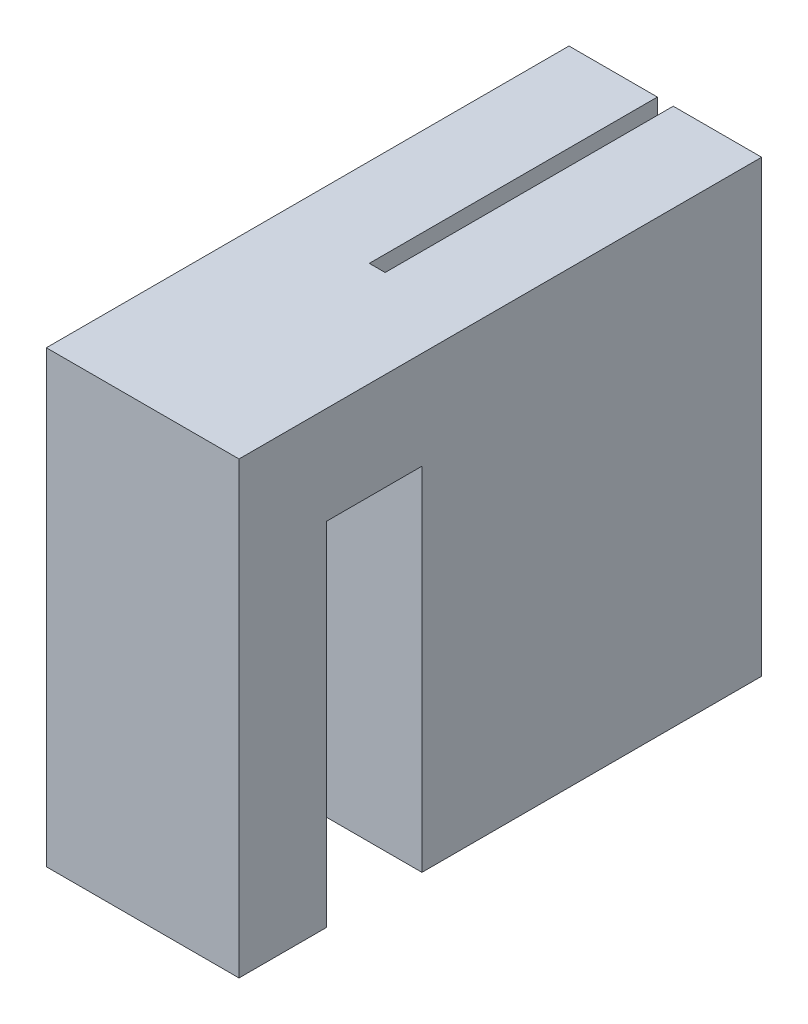
ISO-10303-21;
HEADER;
FILE_DESCRIPTION(('STEP AP214'),'2;1');
FILE_NAME('part.step','',(''),(''),'','','');
FILE_SCHEMA(('AUTOMOTIVE_DESIGN { 1 0 10303 214 1 1 1 1 }'));
ENDSEC;
DATA;
#1=APPLICATION_CONTEXT('core data for automotive mechanical design processes');
#2=APPLICATION_PROTOCOL_DEFINITION('international standard','automotive_design',2000,#1);
#3=PRODUCT_CONTEXT('',#1,'mechanical');
#4=PRODUCT('Part','Part','',(#3));
#5=PRODUCT_RELATED_PRODUCT_CATEGORY('part','',(#4));
#6=PRODUCT_DEFINITION_FORMATION('','',#4);
#7=PRODUCT_DEFINITION_CONTEXT('part definition',#1,'design');
#8=PRODUCT_DEFINITION('design','',#6,#7);
#9=PRODUCT_DEFINITION_SHAPE('','',#8);
#10=(LENGTH_UNIT() NAMED_UNIT(*) SI_UNIT(.MILLI.,.METRE.));
#11=(NAMED_UNIT(*) PLANE_ANGLE_UNIT() SI_UNIT($,.RADIAN.));
#12=(NAMED_UNIT(*) SI_UNIT($,.STERADIAN.) SOLID_ANGLE_UNIT());
#13=UNCERTAINTY_MEASURE_WITH_UNIT(LENGTH_MEASURE(1.E-05),#10,'distance_accuracy_value','');
#14=(GEOMETRIC_REPRESENTATION_CONTEXT(3) GLOBAL_UNCERTAINTY_ASSIGNED_CONTEXT((#13)) GLOBAL_UNIT_ASSIGNED_CONTEXT((#10,
#11,#12)) REPRESENTATION_CONTEXT('',''));
#15=CARTESIAN_POINT('',(0.,0.,0.));
#16=DIRECTION('',(0.,0.,1.));
#17=DIRECTION('',(1.,0.,0.));
#18=AXIS2_PLACEMENT_3D('',#15,#16,#17);
#19=CARTESIAN_POINT('',(-0.912,9.93366486269097,0.));
#20=DIRECTION('',(0.,-1.,0.));
#21=DIRECTION('',(0.,0.,-1.));
#22=AXIS2_PLACEMENT_3D('',#19,#20,#21);
#23=PLANE('',#22);
#24=DIRECTION('',(0.,0.,-1.));
#25=VECTOR('',#24,1.);
#26=CARTESIAN_POINT('',(0.,9.93366486269097,0.));
#27=LINE('',#26,#25);
#28=CARTESIAN_POINT('',(0.,9.93366486269097,-13.4799668601003));
#29=VERTEX_POINT('',#28);
#30=CARTESIAN_POINT('',(0.,9.93366486269097,-30.0377124002651));
#31=VERTEX_POINT('',#30);
#32=EDGE_CURVE('E207',#29,#31,#27,.T.);
#33=ORIENTED_EDGE('',*,*,#32,.T.);
#34=DIRECTION('',(1.,0.,0.));
#35=VECTOR('',#34,1.);
#36=CARTESIAN_POINT('',(-0.912,9.93366486269097,-30.0377124002651));
#37=LINE('',#36,#35);
#38=CARTESIAN_POINT('',(-0.912,9.93366486269097,-30.0377124002651));
#39=VERTEX_POINT('',#38);
#40=EDGE_CURVE('E11',#39,#31,#37,.T.);
#41=ORIENTED_EDGE('',*,*,#40,.F.);
#42=DIRECTION('',(0.,0.,-1.));
#43=VECTOR('',#42,1.);
#44=CARTESIAN_POINT('',(-0.912,9.93366486269097,0.));
#45=LINE('',#44,#43);
#46=CARTESIAN_POINT('',(-0.912,9.93366486269097,-13.4799668601003));
#47=VERTEX_POINT('',#46);
#48=EDGE_CURVE('E38',#47,#39,#45,.T.);
#49=ORIENTED_EDGE('',*,*,#48,.F.);
#50=DIRECTION('',(1.,0.,0.));
#51=VECTOR('',#50,1.);
#52=CARTESIAN_POINT('',(-0.912,9.93366486269097,-13.4799668601003));
#53=LINE('',#52,#51);
#54=EDGE_CURVE('E214',#47,#29,#53,.T.);
#55=ORIENTED_EDGE('',*,*,#54,.T.);
#56=EDGE_LOOP('',(#33,#41,#49,#55));
#57=FACE_BOUND('',#56,.T.);
#58=ADVANCED_FACE('F35',(#57),#23,.F.);
#59=CARTESIAN_POINT('',(-0.912,0.,-30.0377124002651));
#60=DIRECTION('',(0.,0.,1.));
#61=DIRECTION('',(0.,-1.,0.));
#62=AXIS2_PLACEMENT_3D('',#59,#60,#61);
#63=PLANE('',#62);
#64=ORIENTED_EDGE('',*,*,#40,.T.);
#65=DIRECTION('',(0.,-1.,0.));
#66=VECTOR('',#65,1.);
#67=CARTESIAN_POINT('',(0.,0.,-30.0377124002651));
#68=LINE('',#67,#66);
#69=CARTESIAN_POINT('',(0.,25.8349359100739,-30.0377124002651));
#70=VERTEX_POINT('',#69);
#71=EDGE_CURVE('E175',#70,#31,#68,.T.);
#72=ORIENTED_EDGE('',*,*,#71,.F.);
#73=DIRECTION('',(-1.,0.,0.));
#74=VECTOR('',#73,1.);
#75=CARTESIAN_POINT('',(5.08,25.8349359100739,-30.0377124002651));
#76=LINE('',#75,#74);
#77=CARTESIAN_POINT('',(5.08,25.8349359100739,-30.0377124002651));
#78=VERTEX_POINT('',#77);
#79=EDGE_CURVE('E193',#78,#70,#76,.T.);
#80=ORIENTED_EDGE('',*,*,#79,.F.);
#81=DIRECTION('',(0.,-1.,0.));
#82=VECTOR('',#81,1.);
#83=CARTESIAN_POINT('',(5.08,0.,-30.0377124002651));
#84=LINE('',#83,#82);
#85=CARTESIAN_POINT('',(5.08,0.,-30.0377124002651));
#86=VERTEX_POINT('',#85);
#87=EDGE_CURVE('E190',#78,#86,#84,.T.);
#88=ORIENTED_EDGE('',*,*,#87,.T.);
#89=DIRECTION('',(1.,0.,0.));
#90=VECTOR('',#89,1.);
#91=CARTESIAN_POINT('',(-0.912,0.,-30.0377124002651));
#92=LINE('',#91,#90);
#93=CARTESIAN_POINT('',(-5.992,0.,-30.0377124002651));
#94=VERTEX_POINT('',#93);
#95=EDGE_CURVE('E45',#94,#86,#92,.T.);
#96=ORIENTED_EDGE('',*,*,#95,.F.);
#97=DIRECTION('',(0.,-1.,0.));
#98=VECTOR('',#97,1.);
#99=CARTESIAN_POINT('',(-5.992,0.,-30.0377124002651));
#100=LINE('',#99,#98);
#101=CARTESIAN_POINT('',(-5.992,25.8349359100739,-30.0377124002651));
#102=VERTEX_POINT('',#101);
#103=EDGE_CURVE('E141',#102,#94,#100,.T.);
#104=ORIENTED_EDGE('',*,*,#103,.F.);
#105=DIRECTION('',(1.,0.,0.));
#106=VECTOR('',#105,1.);
#107=CARTESIAN_POINT('',(-5.992,25.8349359100739,-30.0377124002651));
#108=LINE('',#107,#106);
#109=CARTESIAN_POINT('',(-0.912,25.8349359100739,-30.0377124002651));
#110=VERTEX_POINT('',#109);
#111=EDGE_CURVE('E137',#102,#110,#108,.T.);
#112=ORIENTED_EDGE('',*,*,#111,.T.);
#113=DIRECTION('',(0.,-1.,0.));
#114=VECTOR('',#113,1.);
#115=CARTESIAN_POINT('',(-0.912,0.,-30.0377124002651));
#116=LINE('',#115,#114);
#117=EDGE_CURVE('E148',#110,#39,#116,.T.);
#118=ORIENTED_EDGE('',*,*,#117,.T.);
#119=EDGE_LOOP('',(#64,#72,#80,#88,#96,#104,#112,#118));
#120=FACE_BOUND('',#119,.T.);
#121=ADVANCED_FACE('F240',(#120),#63,.F.);
#122=CARTESIAN_POINT('',(-0.912,0.,0.));
#123=DIRECTION('',(0.,-1.,0.));
#124=DIRECTION('',(0.,0.,-1.));
#125=AXIS2_PLACEMENT_3D('',#122,#123,#124);
#126=PLANE('',#125);
#127=ORIENTED_EDGE('',*,*,#95,.T.);
#128=DIRECTION('',(0.,0.,-1.));
#129=VECTOR('',#128,1.);
#130=CARTESIAN_POINT('',(5.08,0.,0.));
#131=LINE('',#130,#129);
#132=CARTESIAN_POINT('',(5.08,0.,-10.5149830621972));
#133=VERTEX_POINT('',#132);
#134=EDGE_CURVE('E181',#133,#86,#131,.T.);
#135=ORIENTED_EDGE('',*,*,#134,.F.);
#136=DIRECTION('',(1.,0.,0.));
#137=VECTOR('',#136,1.);
#138=CARTESIAN_POINT('',(-0.912,0.,-10.5149830621972));
#139=LINE('',#138,#137);
#140=CARTESIAN_POINT('',(-5.992,0.,-10.5149830621972));
#141=VERTEX_POINT('',#140);
#142=EDGE_CURVE('E427',#141,#133,#139,.T.);
#143=ORIENTED_EDGE('',*,*,#142,.F.);
#144=DIRECTION('',(0.,0.,1.));
#145=VECTOR('',#144,1.);
#146=CARTESIAN_POINT('',(-5.992,0.,-10.5149830621972));
#147=LINE('',#146,#145);
#148=EDGE_CURVE('E155',#94,#141,#147,.T.);
#149=ORIENTED_EDGE('',*,*,#148,.F.);
#150=EDGE_LOOP('',(#127,#135,#143,#149));
#151=FACE_BOUND('',#150,.T.);
#152=ADVANCED_FACE('F244',(#151),#126,.T.);
#153=CARTESIAN_POINT('',(-0.912,0.,-10.5149830621972));
#154=DIRECTION('',(0.,0.,1.));
#155=DIRECTION('',(1.,0.,0.));
#156=AXIS2_PLACEMENT_3D('',#153,#154,#155);
#157=PLANE('',#156);
#158=ORIENTED_EDGE('',*,*,#142,.T.);
#159=DIRECTION('',(0.,-1.,0.));
#160=VECTOR('',#159,1.);
#161=CARTESIAN_POINT('',(5.08,0.,-10.5149830621972));
#162=LINE('',#161,#160);
#163=CARTESIAN_POINT('',(5.08,20.2184319162735,-10.5149830621972));
#164=VERTEX_POINT('',#163);
#165=EDGE_CURVE('E187',#164,#133,#162,.T.);
#166=ORIENTED_EDGE('',*,*,#165,.F.);
#167=DIRECTION('',(1.,0.,0.));
#168=VECTOR('',#167,1.);
#169=CARTESIAN_POINT('',(-0.912,20.2184319162735,-10.5149830621972));
#170=LINE('',#169,#168);
#171=CARTESIAN_POINT('',(-5.992,20.2184319162735,-10.5149830621972));
#172=VERTEX_POINT('',#171);
#173=EDGE_CURVE('E425',#172,#164,#170,.T.);
#174=ORIENTED_EDGE('',*,*,#173,.F.);
#175=DIRECTION('',(0.,1.,0.));
#176=VECTOR('',#175,1.);
#177=CARTESIAN_POINT('',(-5.992,20.2184319162735,-10.5149830621972));
#178=LINE('',#177,#176);
#179=EDGE_CURVE('E158',#141,#172,#178,.T.);
#180=ORIENTED_EDGE('',*,*,#179,.F.);
#181=EDGE_LOOP('',(#158,#166,#174,#180));
#182=FACE_BOUND('',#181,.T.);
#183=ADVANCED_FACE('F250',(#182),#157,.T.);
#184=CARTESIAN_POINT('',(-0.912,20.2184319162735,0.));
#185=DIRECTION('',(0.,-1.,0.));
#186=DIRECTION('',(0.,0.,-1.));
#187=AXIS2_PLACEMENT_3D('',#184,#185,#186);
#188=PLANE('',#187);
#189=ORIENTED_EDGE('',*,*,#173,.T.);
#190=DIRECTION('',(0.,0.,-1.));
#191=VECTOR('',#190,1.);
#192=CARTESIAN_POINT('',(5.08,20.2184319162735,0.));
#193=LINE('',#192,#191);
#194=CARTESIAN_POINT('',(5.08,20.2184319162735,-5.01498306219718));
#195=VERTEX_POINT('',#194);
#196=EDGE_CURVE('E184',#195,#164,#193,.T.);
#197=ORIENTED_EDGE('',*,*,#196,.F.);
#198=DIRECTION('',(1.,0.,0.));
#199=VECTOR('',#198,1.);
#200=CARTESIAN_POINT('',(-0.912,20.2184319162735,-5.01498306219718));
#201=LINE('',#200,#199);
#202=CARTESIAN_POINT('',(-5.992,20.2184319162735,-5.01498306219718));
#203=VERTEX_POINT('',#202);
#204=EDGE_CURVE('E421',#203,#195,#201,.T.);
#205=ORIENTED_EDGE('',*,*,#204,.F.);
#206=DIRECTION('',(0.,0.,1.));
#207=VECTOR('',#206,1.);
#208=CARTESIAN_POINT('',(-5.992,20.2184319162735,-5.01498306219718));
#209=LINE('',#208,#207);
#210=EDGE_CURVE('E161',#172,#203,#209,.T.);
#211=ORIENTED_EDGE('',*,*,#210,.F.);
#212=EDGE_LOOP('',(#189,#197,#205,#211));
#213=FACE_BOUND('',#212,.T.);
#214=ADVANCED_FACE('F259',(#213),#188,.T.);
#215=CARTESIAN_POINT('',(-0.912,0.,-5.01498306219718));
#216=DIRECTION('',(0.,0.,-1.));
#217=DIRECTION('',(-1.,0.,0.));
#218=AXIS2_PLACEMENT_3D('',#215,#216,#217);
#219=PLANE('',#218);
#220=ORIENTED_EDGE('',*,*,#204,.T.);
#221=DIRECTION('',(0.,1.,0.));
#222=VECTOR('',#221,1.);
#223=CARTESIAN_POINT('',(5.08,0.,-5.01498306219718));
#224=LINE('',#223,#222);
#225=CARTESIAN_POINT('',(5.08,0.,-5.01498306219718));
#226=VERTEX_POINT('',#225);
#227=EDGE_CURVE('E180',#226,#195,#224,.T.);
#228=ORIENTED_EDGE('',*,*,#227,.F.);
#229=DIRECTION('',(1.,0.,0.));
#230=VECTOR('',#229,1.);
#231=CARTESIAN_POINT('',(-0.912,0.,-5.01498306219718));
#232=LINE('',#231,#230);
#233=CARTESIAN_POINT('',(-5.992,0.,-5.01498306219718));
#234=VERTEX_POINT('',#233);
#235=EDGE_CURVE('E418',#234,#226,#232,.T.);
#236=ORIENTED_EDGE('',*,*,#235,.F.);
#237=DIRECTION('',(0.,-1.,0.));
#238=VECTOR('',#237,1.);
#239=CARTESIAN_POINT('',(-5.992,0.,-5.01498306219718));
#240=LINE('',#239,#238);
#241=EDGE_CURVE('E164',#203,#234,#240,.T.);
#242=ORIENTED_EDGE('',*,*,#241,.F.);
#243=EDGE_LOOP('',(#220,#228,#236,#242));
#244=FACE_BOUND('',#243,.T.);
#245=ADVANCED_FACE('F263',(#244),#219,.T.);
#246=ORIENTED_EDGE('',*,*,#235,.T.);
#247=CARTESIAN_POINT('',(5.08,0.,0.));
#248=VERTEX_POINT('',#247);
#249=EDGE_CURVE('E177',#248,#226,#131,.T.);
#250=ORIENTED_EDGE('',*,*,#249,.F.);
#251=DIRECTION('',(1.,0.,0.));
#252=VECTOR('',#251,1.);
#253=CARTESIAN_POINT('',(-0.912,0.,0.));
#254=LINE('',#253,#252);
#255=CARTESIAN_POINT('',(-5.992,0.,0.));
#256=VERTEX_POINT('',#255);
#257=EDGE_CURVE('E130',#256,#248,#254,.T.);
#258=ORIENTED_EDGE('',*,*,#257,.F.);
#259=DIRECTION('',(0.,0.,1.));
#260=VECTOR('',#259,1.);
#261=CARTESIAN_POINT('',(-5.992,0.,0.));
#262=LINE('',#261,#260);
#263=EDGE_CURVE('E147',#234,#256,#262,.T.);
#264=ORIENTED_EDGE('',*,*,#263,.F.);
#265=EDGE_LOOP('',(#246,#250,#258,#264));
#266=FACE_BOUND('',#265,.T.);
#267=ADVANCED_FACE('F253',(#266),#126,.T.);
#268=CARTESIAN_POINT('',(-0.912,0.,0.));
#269=DIRECTION('',(0.,0.,1.));
#270=DIRECTION('',(0.,-1.,0.));
#271=AXIS2_PLACEMENT_3D('',#268,#269,#270);
#272=PLANE('',#271);
#273=ORIENTED_EDGE('',*,*,#257,.T.);
#274=DIRECTION('',(0.,-1.,0.));
#275=VECTOR('',#274,1.);
#276=CARTESIAN_POINT('',(5.08,0.,0.));
#277=LINE('',#276,#275);
#278=CARTESIAN_POINT('',(5.08,25.8349359100739,0.));
#279=VERTEX_POINT('',#278);
#280=EDGE_CURVE('E126',#279,#248,#277,.T.);
#281=ORIENTED_EDGE('',*,*,#280,.F.);
#282=DIRECTION('',(1.,0.,0.));
#283=VECTOR('',#282,1.);
#284=CARTESIAN_POINT('',(-0.912,25.8349359100739,0.));
#285=LINE('',#284,#283);
#286=CARTESIAN_POINT('',(-5.992,25.8349359100739,0.));
#287=VERTEX_POINT('',#286);
#288=EDGE_CURVE('E120',#287,#279,#285,.T.);
#289=ORIENTED_EDGE('',*,*,#288,.F.);
#290=DIRECTION('',(0.,1.,0.));
#291=VECTOR('',#290,1.);
#292=CARTESIAN_POINT('',(-5.992,25.8349359100739,0.));
#293=LINE('',#292,#291);
#294=EDGE_CURVE('E124',#256,#287,#293,.T.);
#295=ORIENTED_EDGE('',*,*,#294,.F.);
#296=EDGE_LOOP('',(#273,#281,#289,#295));
#297=FACE_BOUND('',#296,.T.);
#298=ADVANCED_FACE('F122',(#297),#272,.T.);
#299=CARTESIAN_POINT('',(-0.912,25.8349359100739,0.));
#300=DIRECTION('',(0.,-1.,0.));
#301=DIRECTION('',(0.,0.,-1.));
#302=AXIS2_PLACEMENT_3D('',#299,#300,#301);
#303=PLANE('',#302);
#304=ORIENTED_EDGE('',*,*,#288,.T.);
#305=DIRECTION('',(0.,0.,-1.));
#306=VECTOR('',#305,1.);
#307=CARTESIAN_POINT('',(5.08,25.8349359100739,0.));
#308=LINE('',#307,#306);
#309=EDGE_CURVE('E173',#279,#78,#308,.T.);
#310=ORIENTED_EDGE('',*,*,#309,.T.);
#311=ORIENTED_EDGE('',*,*,#79,.T.);
#312=DIRECTION('',(0.,0.,-1.));
#313=VECTOR('',#312,1.);
#314=CARTESIAN_POINT('',(0.,25.8349359100739,0.));
#315=LINE('',#314,#313);
#316=CARTESIAN_POINT('',(0.,25.8349359100739,-13.4799668601003));
#317=VERTEX_POINT('',#316);
#318=EDGE_CURVE('E199',#317,#70,#315,.T.);
#319=ORIENTED_EDGE('',*,*,#318,.F.);
#320=DIRECTION('',(1.,0.,0.));
#321=VECTOR('',#320,1.);
#322=CARTESIAN_POINT('',(-0.912,25.8349359100739,-13.4799668601003));
#323=LINE('',#322,#321);
#324=CARTESIAN_POINT('',(-0.912,25.8349359100739,-13.4799668601003));
#325=VERTEX_POINT('',#324);
#326=EDGE_CURVE('E131',#325,#317,#323,.T.);
#327=ORIENTED_EDGE('',*,*,#326,.F.);
#328=DIRECTION('',(0.,0.,-1.));
#329=VECTOR('',#328,1.);
#330=CARTESIAN_POINT('',(-0.912,25.8349359100739,-30.0377124002651));
#331=LINE('',#330,#329);
#332=EDGE_CURVE('E151',#325,#110,#331,.T.);
#333=ORIENTED_EDGE('',*,*,#332,.T.);
#334=ORIENTED_EDGE('',*,*,#111,.F.);
#335=DIRECTION('',(0.,0.,-1.));
#336=VECTOR('',#335,1.);
#337=CARTESIAN_POINT('',(-5.992,25.8349359100739,-30.0377124002651));
#338=LINE('',#337,#336);
#339=EDGE_CURVE('E134',#287,#102,#338,.T.);
#340=ORIENTED_EDGE('',*,*,#339,.F.);
#341=EDGE_LOOP('',(#304,#310,#311,#319,#327,#333,#334,#340));
#342=FACE_BOUND('',#341,.T.);
#343=ADVANCED_FACE('F135',(#342),#303,.F.);
#344=CARTESIAN_POINT('',(-0.912,0.,-13.4799668601003));
#345=DIRECTION('',(0.,0.,1.));
#346=DIRECTION('',(0.,-1.,0.));
#347=AXIS2_PLACEMENT_3D('',#344,#345,#346);
#348=PLANE('',#347);
#349=DIRECTION('',(0.,-1.,0.));
#350=VECTOR('',#349,1.);
#351=CARTESIAN_POINT('',(0.,0.,-13.4799668601003));
#352=LINE('',#351,#350);
#353=EDGE_CURVE('E210',#317,#29,#352,.T.);
#354=ORIENTED_EDGE('',*,*,#353,.T.);
#355=ORIENTED_EDGE('',*,*,#54,.F.);
#356=DIRECTION('',(0.,-1.,0.));
#357=VECTOR('',#356,1.);
#358=CARTESIAN_POINT('',(-0.912,0.,-13.4799668601003));
#359=LINE('',#358,#357);
#360=EDGE_CURVE('E212',#325,#47,#359,.T.);
#361=ORIENTED_EDGE('',*,*,#360,.F.);
#362=ORIENTED_EDGE('',*,*,#326,.T.);
#363=EDGE_LOOP('',(#354,#355,#361,#362));
#364=FACE_BOUND('',#363,.T.);
#365=ADVANCED_FACE('F232',(#364),#348,.F.);
#366=CARTESIAN_POINT('',(5.08,0.,0.));
#367=DIRECTION('',(1.,0.,0.));
#368=DIRECTION('',(0.,0.,-1.));
#369=AXIS2_PLACEMENT_3D('',#366,#367,#368);
#370=PLANE('',#369);
#371=ORIENTED_EDGE('',*,*,#309,.F.);
#372=ORIENTED_EDGE('',*,*,#280,.T.);
#373=ORIENTED_EDGE('',*,*,#249,.T.);
#374=ORIENTED_EDGE('',*,*,#227,.T.);
#375=ORIENTED_EDGE('',*,*,#196,.T.);
#376=ORIENTED_EDGE('',*,*,#165,.T.);
#377=ORIENTED_EDGE('',*,*,#134,.T.);
#378=ORIENTED_EDGE('',*,*,#87,.F.);
#379=EDGE_LOOP('',(#371,#372,#373,#374,#375,#376,#377,#378));
#380=FACE_BOUND('',#379,.T.);
#381=ADVANCED_FACE('F272',(#380),#370,.T.);
#382=CARTESIAN_POINT('',(0.,0.,0.));
#383=DIRECTION('',(1.,0.,0.));
#384=DIRECTION('',(0.,0.,-1.));
#385=AXIS2_PLACEMENT_3D('',#382,#383,#384);
#386=PLANE('',#385);
#387=ORIENTED_EDGE('',*,*,#32,.F.);
#388=ORIENTED_EDGE('',*,*,#353,.F.);
#389=ORIENTED_EDGE('',*,*,#318,.T.);
#390=ORIENTED_EDGE('',*,*,#71,.T.);
#391=EDGE_LOOP('',(#387,#388,#389,#390));
#392=FACE_BOUND('',#391,.T.);
#393=ADVANCED_FACE('F238',(#392),#386,.F.);
#394=CARTESIAN_POINT('',(-5.992,0.,0.));
#395=DIRECTION('',(1.,0.,0.));
#396=DIRECTION('',(0.,0.,-1.));
#397=AXIS2_PLACEMENT_3D('',#394,#395,#396);
#398=PLANE('',#397);
#399=ORIENTED_EDGE('',*,*,#294,.T.);
#400=ORIENTED_EDGE('',*,*,#339,.T.);
#401=ORIENTED_EDGE('',*,*,#103,.T.);
#402=ORIENTED_EDGE('',*,*,#148,.T.);
#403=ORIENTED_EDGE('',*,*,#179,.T.);
#404=ORIENTED_EDGE('',*,*,#210,.T.);
#405=ORIENTED_EDGE('',*,*,#241,.T.);
#406=ORIENTED_EDGE('',*,*,#263,.T.);
#407=EDGE_LOOP('',(#399,#400,#401,#402,#403,#404,#405,#406));
#408=FACE_BOUND('',#407,.T.);
#409=ADVANCED_FACE('F144',(#408),#398,.F.);
#410=CARTESIAN_POINT('',(-0.912,0.,0.));
#411=DIRECTION('',(1.,0.,0.));
#412=DIRECTION('',(0.,0.,-1.));
#413=AXIS2_PLACEMENT_3D('',#410,#411,#412);
#414=PLANE('',#413);
#415=ORIENTED_EDGE('',*,*,#360,.T.);
#416=ORIENTED_EDGE('',*,*,#48,.T.);
#417=ORIENTED_EDGE('',*,*,#117,.F.);
#418=ORIENTED_EDGE('',*,*,#332,.F.);
#419=EDGE_LOOP('',(#415,#416,#417,#418));
#420=FACE_BOUND('',#419,.T.);
#421=ADVANCED_FACE('F281',(#420),#414,.T.);
#422=CLOSED_SHELL('',(#58,#121,#152,#183,#214,#245,#267,#298,#343,#365,#381,#393,#409,#421));
#423=MANIFOLD_SOLID_BREP('B2',#422);
#424=ADVANCED_BREP_SHAPE_REPRESENTATION('',(#18,#423),#14);
#425=SHAPE_DEFINITION_REPRESENTATION(#9,#424);
ENDSEC;
END-ISO-10303-21;
